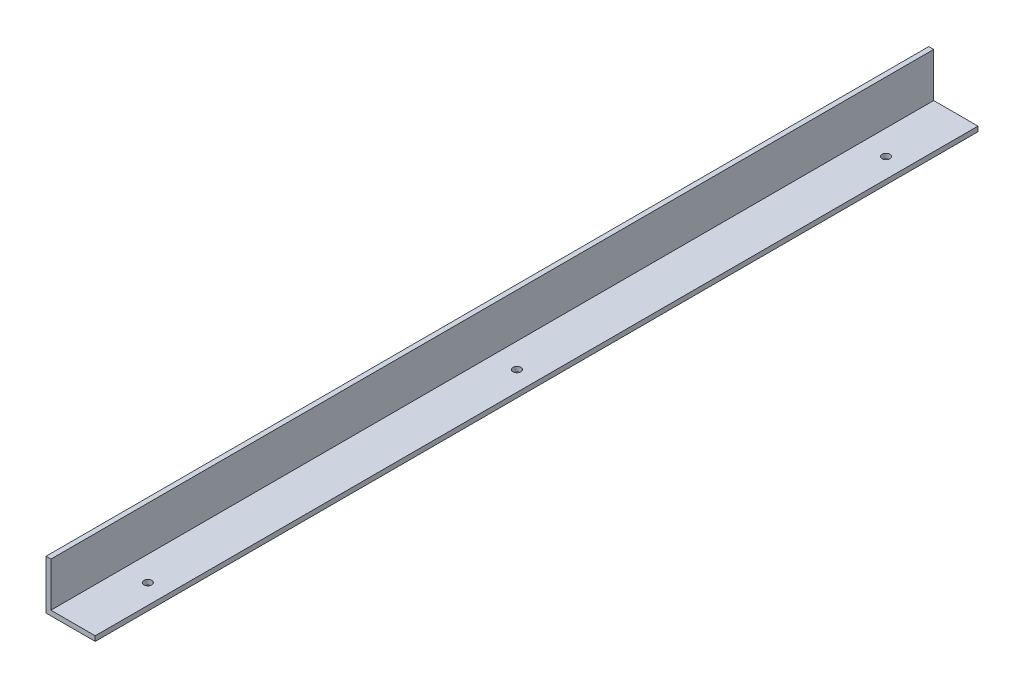
ISO-10303-21;
HEADER;
FILE_DESCRIPTION(('STEP AP214'),'2;1');
FILE_NAME('part.step','',(''),(''),'','','');
FILE_SCHEMA(('AUTOMOTIVE_DESIGN { 1 0 10303 214 1 1 1 1 }'));
ENDSEC;
DATA;
#1=APPLICATION_CONTEXT('core data for automotive mechanical design processes');
#2=APPLICATION_PROTOCOL_DEFINITION('international standard','automotive_design',2000,#1);
#3=PRODUCT_CONTEXT('',#1,'mechanical');
#4=PRODUCT('Part','Part','',(#3));
#5=PRODUCT_RELATED_PRODUCT_CATEGORY('part','',(#4));
#6=PRODUCT_DEFINITION_FORMATION('','',#4);
#7=PRODUCT_DEFINITION_CONTEXT('part definition',#1,'design');
#8=PRODUCT_DEFINITION('design','',#6,#7);
#9=PRODUCT_DEFINITION_SHAPE('','',#8);
#10=(LENGTH_UNIT() NAMED_UNIT(*) SI_UNIT(.MILLI.,.METRE.));
#11=(NAMED_UNIT(*) PLANE_ANGLE_UNIT() SI_UNIT($,.RADIAN.));
#12=(NAMED_UNIT(*) SI_UNIT($,.STERADIAN.) SOLID_ANGLE_UNIT());
#13=UNCERTAINTY_MEASURE_WITH_UNIT(LENGTH_MEASURE(1.E-05),#10,'distance_accuracy_value','');
#14=(GEOMETRIC_REPRESENTATION_CONTEXT(3) GLOBAL_UNCERTAINTY_ASSIGNED_CONTEXT((#13)) GLOBAL_UNIT_ASSIGNED_CONTEXT((#10,
#11,#12)) REPRESENTATION_CONTEXT('',''));
#15=CARTESIAN_POINT('',(0.,0.,0.));
#16=DIRECTION('',(0.,0.,1.));
#17=DIRECTION('',(1.,0.,0.));
#18=AXIS2_PLACEMENT_3D('',#15,#16,#17);
#19=CARTESIAN_POINT('',(6.07517582553863,-8.53025970804988,-375.));
#20=DIRECTION('',(0.,-0.999999999999998,0.));
#21=DIRECTION('',(1.,0.,0.));
#22=AXIS2_PLACEMENT_3D('',#19,#20,#21);
#23=CYLINDRICAL_SURFACE('',#22,4.);
#24=CARTESIAN_POINT('',(6.07517582553863,-18.5302597080499,-375.));
#25=DIRECTION('',(0.,-0.999999999999998,0.));
#26=DIRECTION('',(1.,0.,0.));
#27=AXIS2_PLACEMENT_3D('',#24,#25,#26);
#28=CIRCLE('',#27,4.);
#29=CARTESIAN_POINT('',(10.0751758255386,-18.5302597080499,-375.));
#30=VERTEX_POINT('',#29);
#31=EDGE_CURVE('E49',#30,#30,#28,.T.);
#32=CARTESIAN_POINT('',(6.07517582553863,-13.5302597080499,-375.));
#33=DIRECTION('',(0.,-0.999999999999998,0.));
#34=DIRECTION('',(1.,0.,0.));
#35=AXIS2_PLACEMENT_3D('',#32,#33,#34);
#36=CIRCLE('',#35,4.);
#37=CARTESIAN_POINT('',(10.0751758255386,-13.5302597080499,-375.));
#38=VERTEX_POINT('',#37);
#39=EDGE_CURVE('E11',#38,#38,#36,.T.);
#40=CARTESIAN_POINT('',(10.0751758255386,-18.5302597080499,-375.));
#41=CARTESIAN_POINT('',(10.0751758255386,-18.4781763747166,-375.));
#42=CARTESIAN_POINT('',(10.0751758255386,-18.4260930413832,-375.));
#43=CARTESIAN_POINT('',(10.0751758255386,-18.3219263747166,-375.));
#44=CARTESIAN_POINT('',(10.0751758255386,-18.2698430413832,-375.));
#45=CARTESIAN_POINT('',(10.0751758255386,-18.1656763747166,-375.));
#46=CARTESIAN_POINT('',(10.0751758255386,-18.1135930413832,-375.));
#47=CARTESIAN_POINT('',(10.0751758255386,-18.0094263747166,-375.));
#48=CARTESIAN_POINT('',(10.0751758255386,-17.9573430413832,-375.));
#49=CARTESIAN_POINT('',(10.0751758255386,-17.8531763747166,-375.));
#50=CARTESIAN_POINT('',(10.0751758255386,-17.8010930413832,-375.));
#51=CARTESIAN_POINT('',(10.0751758255386,-17.6969263747166,-375.));
#52=CARTESIAN_POINT('',(10.0751758255386,-17.6448430413832,-375.));
#53=CARTESIAN_POINT('',(10.0751758255386,-17.5406763747166,-375.));
#54=CARTESIAN_POINT('',(10.0751758255386,-17.4885930413832,-375.));
#55=CARTESIAN_POINT('',(10.0751758255386,-17.3844263747166,-375.));
#56=CARTESIAN_POINT('',(10.0751758255386,-17.3323430413832,-375.));
#57=CARTESIAN_POINT('',(10.0751758255386,-17.2281763747166,-375.));
#58=CARTESIAN_POINT('',(10.0751758255386,-17.1760930413832,-375.));
#59=CARTESIAN_POINT('',(10.0751758255386,-17.0719263747166,-375.));
#60=CARTESIAN_POINT('',(10.0751758255386,-17.0198430413832,-375.));
#61=CARTESIAN_POINT('',(10.0751758255386,-16.9156763747166,-375.));
#62=CARTESIAN_POINT('',(10.0751758255386,-16.8635930413832,-375.));
#63=CARTESIAN_POINT('',(10.0751758255386,-16.7594263747166,-375.));
#64=CARTESIAN_POINT('',(10.0751758255386,-16.7073430413832,-375.));
#65=CARTESIAN_POINT('',(10.0751758255386,-16.6031763747166,-375.));
#66=CARTESIAN_POINT('',(10.0751758255386,-16.5510930413832,-375.));
#67=CARTESIAN_POINT('',(10.0751758255386,-16.4469263747166,-375.));
#68=CARTESIAN_POINT('',(10.0751758255386,-16.3948430413832,-375.));
#69=CARTESIAN_POINT('',(10.0751758255386,-16.2906763747166,-375.));
#70=CARTESIAN_POINT('',(10.0751758255386,-16.2385930413832,-375.));
#71=CARTESIAN_POINT('',(10.0751758255386,-16.1344263747166,-375.));
#72=CARTESIAN_POINT('',(10.0751758255386,-16.0823430413832,-375.));
#73=CARTESIAN_POINT('',(10.0751758255386,-15.9781763747166,-375.));
#74=CARTESIAN_POINT('',(10.0751758255386,-15.9260930413832,-375.));
#75=CARTESIAN_POINT('',(10.0751758255386,-15.8219263747166,-375.));
#76=CARTESIAN_POINT('',(10.0751758255386,-15.7698430413832,-375.));
#77=CARTESIAN_POINT('',(10.0751758255386,-15.6656763747166,-375.));
#78=CARTESIAN_POINT('',(10.0751758255386,-15.6135930413832,-375.));
#79=CARTESIAN_POINT('',(10.0751758255386,-15.5094263747166,-375.));
#80=CARTESIAN_POINT('',(10.0751758255386,-15.4573430413832,-375.));
#81=CARTESIAN_POINT('',(10.0751758255386,-15.3531763747166,-375.));
#82=CARTESIAN_POINT('',(10.0751758255386,-15.3010930413832,-375.));
#83=CARTESIAN_POINT('',(10.0751758255386,-15.1969263747166,-375.));
#84=CARTESIAN_POINT('',(10.0751758255386,-15.1448430413832,-375.));
#85=CARTESIAN_POINT('',(10.0751758255386,-15.0406763747166,-375.));
#86=CARTESIAN_POINT('',(10.0751758255386,-14.9885930413832,-375.));
#87=CARTESIAN_POINT('',(10.0751758255386,-14.8844263747166,-375.));
#88=CARTESIAN_POINT('',(10.0751758255386,-14.8323430413832,-375.));
#89=CARTESIAN_POINT('',(10.0751758255386,-14.7281763747166,-375.));
#90=CARTESIAN_POINT('',(10.0751758255386,-14.6760930413832,-375.));
#91=CARTESIAN_POINT('',(10.0751758255386,-14.5719263747166,-375.));
#92=CARTESIAN_POINT('',(10.0751758255386,-14.5198430413832,-375.));
#93=CARTESIAN_POINT('',(10.0751758255386,-14.4156763747166,-375.));
#94=CARTESIAN_POINT('',(10.0751758255386,-14.3635930413832,-375.));
#95=CARTESIAN_POINT('',(10.0751758255386,-14.2594263747166,-375.));
#96=CARTESIAN_POINT('',(10.0751758255386,-14.2073430413832,-375.));
#97=CARTESIAN_POINT('',(10.0751758255386,-14.1031763747166,-375.));
#98=CARTESIAN_POINT('',(10.0751758255386,-14.0510930413832,-375.));
#99=CARTESIAN_POINT('',(10.0751758255386,-13.9469263747166,-375.));
#100=CARTESIAN_POINT('',(10.0751758255386,-13.8948430413832,-375.));
#101=CARTESIAN_POINT('',(10.0751758255386,-13.7906763747166,-375.));
#102=CARTESIAN_POINT('',(10.0751758255386,-13.7385930413832,-375.));
#103=CARTESIAN_POINT('',(10.0751758255386,-13.6344263747166,-375.));
#104=CARTESIAN_POINT('',(10.0751758255386,-13.5823430413832,-375.));
#105=CARTESIAN_POINT('',(10.0751758255386,-13.5302597080499,-375.));
#106=B_SPLINE_CURVE_WITH_KNOTS('',3,(#40,#41,#42,#43,#44,#45,#46,#47,#48,#49,#50,#51,#52,#53,
#54,#55,#56,#57,#58,#59,#60,#61,#62,#63,#64,#65,#66,#67,#68,#69,#70,#71,#72,#73,#74,#75,#76,#77,
#78,#79,#80,#81,#82,#83,#84,#85,#86,#87,#88,#89,#90,#91,#92,#93,#94,#95,#96,#97,#98,#99,#100,
#101,#102,#103,#104,#105),.UNSPECIFIED.,.F.,.F.,(4,2,2,2,2,2,2,2,2,2,2,2,2,2,2,2,2,2,2,2,2,2,2,
2,2,2,2,2,2,2,2,2,4),(0.,0.156249999999997,0.3125,0.468749999999997,0.625000000000001,
0.781249999999997,0.937500000000001,1.09375,1.25,1.40625,1.5625,1.71875,1.875,2.03125,2.1875,
2.34375,2.5,2.65625,2.8125,2.96875,3.125,3.28125,3.4375,3.59375,3.75,3.90625,4.0625,4.21875,
4.375,4.53125,4.6875,4.84375,5.),.UNSPECIFIED.);
#107=EDGE_CURVE('BSEAM40',#30,#38,#106,.T.);
#108=ORIENTED_EDGE('',*,*,#31,.T.);
#109=ORIENTED_EDGE('',*,*,#39,.F.);
#110=ORIENTED_EDGE('',*,*,#107,.T.);
#111=ORIENTED_EDGE('',*,*,#107,.F.);
#112=EDGE_LOOP('',(#108,#110,#109,#111));
#113=FACE_BOUND('',#112,.T.);
#114=ADVANCED_FACE('F40',(#113),#23,.F.);
#115=CARTESIAN_POINT('',(-23.9248241744614,31.4697402919498,448.5));
#116=DIRECTION('',(0.,-0.999999999999998,0.));
#117=DIRECTION('',(0.,0.,-1.));
#118=AXIS2_PLACEMENT_3D('',#115,#116,#117);
#119=PLANE('',#118);
#120=DIRECTION('',(-1.,0.,0.));
#121=VECTOR('',#120,1.);
#122=CARTESIAN_POINT('',(-23.9248241744615,31.4697402919498,-448.5));
#123=LINE('',#122,#121);
#124=CARTESIAN_POINT('',(-18.9248241744615,31.4697402919498,-448.5));
#125=VERTEX_POINT('',#124);
#126=CARTESIAN_POINT('',(-23.9248241744615,31.4697402919498,-448.5));
#127=VERTEX_POINT('',#126);
#128=EDGE_CURVE('E132',#125,#127,#123,.T.);
#129=ORIENTED_EDGE('',*,*,#128,.T.);
#130=DIRECTION('',(0.,0.,-1.));
#131=VECTOR('',#130,1.);
#132=CARTESIAN_POINT('',(-23.9248241744614,31.4697402919498,448.5));
#133=LINE('',#132,#131);
#134=CARTESIAN_POINT('',(-23.9248241744614,31.4697402919498,448.5));
#135=VERTEX_POINT('',#134);
#136=EDGE_CURVE('E160',#135,#127,#133,.T.);
#137=ORIENTED_EDGE('',*,*,#136,.F.);
#138=DIRECTION('',(-1.,0.,0.));
#139=VECTOR('',#138,1.);
#140=CARTESIAN_POINT('',(-23.9248241744614,31.4697402919498,448.5));
#141=LINE('',#140,#139);
#142=CARTESIAN_POINT('',(-18.9248241744615,31.4697402919498,448.5));
#143=VERTEX_POINT('',#142);
#144=EDGE_CURVE('E149',#143,#135,#141,.T.);
#145=ORIENTED_EDGE('',*,*,#144,.F.);
#146=DIRECTION('',(0.,0.,-1.));
#147=VECTOR('',#146,1.);
#148=CARTESIAN_POINT('',(-18.9248241744615,31.4697402919498,448.5));
#149=LINE('',#148,#147);
#150=EDGE_CURVE('E128',#143,#125,#149,.T.);
#151=ORIENTED_EDGE('',*,*,#150,.T.);
#152=EDGE_LOOP('',(#129,#137,#145,#151));
#153=FACE_BOUND('',#152,.T.);
#154=ADVANCED_FACE('F183',(#153),#119,.F.);
#155=CARTESIAN_POINT('',(-23.9248241744614,-18.5302597080502,448.5));
#156=DIRECTION('',(1.,0.,0.));
#157=DIRECTION('',(0.,0.,-1.));
#158=AXIS2_PLACEMENT_3D('',#155,#156,#157);
#159=PLANE('',#158);
#160=DIRECTION('',(0.,-0.999999999999998,0.));
#161=VECTOR('',#160,1.);
#162=CARTESIAN_POINT('',(-23.9248241744615,-18.5302597080501,-448.5));
#163=LINE('',#162,#161);
#164=CARTESIAN_POINT('',(-23.9248241744615,-18.5302597080501,-448.5));
#165=VERTEX_POINT('',#164);
#166=EDGE_CURVE('E136',#127,#165,#163,.T.);
#167=ORIENTED_EDGE('',*,*,#166,.T.);
#168=DIRECTION('',(0.,0.,-1.));
#169=VECTOR('',#168,1.);
#170=CARTESIAN_POINT('',(-23.9248241744614,-18.5302597080502,448.5));
#171=LINE('',#170,#169);
#172=CARTESIAN_POINT('',(-23.9248241744614,-18.5302597080502,448.5));
#173=VERTEX_POINT('',#172);
#174=EDGE_CURVE('E156',#173,#165,#171,.T.);
#175=ORIENTED_EDGE('',*,*,#174,.F.);
#176=DIRECTION('',(0.,-0.999999999999998,0.));
#177=VECTOR('',#176,1.);
#178=CARTESIAN_POINT('',(-23.9248241744614,-18.5302597080502,448.5));
#179=LINE('',#178,#177);
#180=EDGE_CURVE('E95',#135,#173,#179,.T.);
#181=ORIENTED_EDGE('',*,*,#180,.F.);
#182=ORIENTED_EDGE('',*,*,#136,.T.);
#183=EDGE_LOOP('',(#167,#175,#181,#182));
#184=FACE_BOUND('',#183,.T.);
#185=ADVANCED_FACE('F175',(#184),#159,.F.);
#186=CARTESIAN_POINT('',(26.0751758255386,-18.5302597080499,448.5));
#187=DIRECTION('',(0.,0.999999999999998,0.));
#188=DIRECTION('',(-1.,0.,0.));
#189=AXIS2_PLACEMENT_3D('',#186,#187,#188);
#190=PLANE('',#189);
#191=CARTESIAN_POINT('',(6.07517582553863,-18.5302597080499,0.));
#192=DIRECTION('',(0.,-0.999999999999998,0.));
#193=DIRECTION('',(1.,0.,0.));
#194=AXIS2_PLACEMENT_3D('',#191,#192,#193);
#195=CIRCLE('',#194,4.);
#196=CARTESIAN_POINT('',(10.0751758255386,-18.5302597080499,0.));
#197=VERTEX_POINT('',#196);
#198=EDGE_CURVE('E215',#197,#197,#195,.T.);
#199=ORIENTED_EDGE('',*,*,#198,.F.);
#200=EDGE_LOOP('',(#199));
#201=FACE_BOUND('',#200,.T.);
#202=CARTESIAN_POINT('',(6.07517582553857,-18.5302597080501,375.));
#203=DIRECTION('',(0.,-0.999999999999998,0.));
#204=DIRECTION('',(1.,0.,0.));
#205=AXIS2_PLACEMENT_3D('',#202,#203,#204);
#206=CIRCLE('',#205,4.);
#207=CARTESIAN_POINT('',(10.0751758255386,-18.5302597080501,375.));
#208=VERTEX_POINT('',#207);
#209=EDGE_CURVE('E165',#208,#208,#206,.T.);
#210=ORIENTED_EDGE('',*,*,#209,.F.);
#211=EDGE_LOOP('',(#210));
#212=FACE_BOUND('',#211,.T.);
#213=DIRECTION('',(1.,0.,0.));
#214=VECTOR('',#213,1.);
#215=CARTESIAN_POINT('',(26.0751758255386,-18.5302597080499,-448.5));
#216=LINE('',#215,#214);
#217=CARTESIAN_POINT('',(26.0751758255386,-18.5302597080499,-448.5));
#218=VERTEX_POINT('',#217);
#219=EDGE_CURVE('E140',#165,#218,#216,.T.);
#220=ORIENTED_EDGE('',*,*,#219,.T.);
#221=DIRECTION('',(0.,0.,-1.));
#222=VECTOR('',#221,1.);
#223=CARTESIAN_POINT('',(26.0751758255386,-18.5302597080499,448.5));
#224=LINE('',#223,#222);
#225=CARTESIAN_POINT('',(26.0751758255386,-18.5302597080499,448.5));
#226=VERTEX_POINT('',#225);
#227=EDGE_CURVE('E119',#226,#218,#224,.T.);
#228=ORIENTED_EDGE('',*,*,#227,.F.);
#229=DIRECTION('',(1.,0.,0.));
#230=VECTOR('',#229,1.);
#231=CARTESIAN_POINT('',(26.0751758255386,-18.5302597080499,448.5));
#232=LINE('',#231,#230);
#233=EDGE_CURVE('E108',#173,#226,#232,.T.);
#234=ORIENTED_EDGE('',*,*,#233,.F.);
#235=ORIENTED_EDGE('',*,*,#174,.T.);
#236=EDGE_LOOP('',(#220,#228,#234,#235));
#237=FACE_BOUND('',#236,.T.);
#238=ORIENTED_EDGE('',*,*,#31,.F.);
#239=EDGE_LOOP('',(#238));
#240=FACE_BOUND('',#239,.T.);
#241=ADVANCED_FACE('F173',(#201,#212,#237,#240),#190,.F.);
#242=CARTESIAN_POINT('',(26.0751758255386,-13.5302597080499,448.5));
#243=DIRECTION('',(-1.,0.,0.));
#244=DIRECTION('',(0.,0.,1.));
#245=AXIS2_PLACEMENT_3D('',#242,#243,#244);
#246=PLANE('',#245);
#247=DIRECTION('',(0.,0.999999999999998,0.));
#248=VECTOR('',#247,1.);
#249=CARTESIAN_POINT('',(26.0751758255386,-13.5302597080499,-448.5));
#250=LINE('',#249,#248);
#251=CARTESIAN_POINT('',(26.0751758255386,-13.5302597080499,-448.5));
#252=VERTEX_POINT('',#251);
#253=EDGE_CURVE('E117',#218,#252,#250,.T.);
#254=ORIENTED_EDGE('',*,*,#253,.T.);
#255=DIRECTION('',(0.,0.,-1.));
#256=VECTOR('',#255,1.);
#257=CARTESIAN_POINT('',(26.0751758255386,-13.5302597080499,448.5));
#258=LINE('',#257,#256);
#259=CARTESIAN_POINT('',(26.0751758255386,-13.5302597080499,448.5));
#260=VERTEX_POINT('',#259);
#261=EDGE_CURVE('E114',#260,#252,#258,.T.);
#262=ORIENTED_EDGE('',*,*,#261,.F.);
#263=DIRECTION('',(0.,0.999999999999998,0.));
#264=VECTOR('',#263,1.);
#265=CARTESIAN_POINT('',(26.0751758255386,-13.5302597080499,448.5));
#266=LINE('',#265,#264);
#267=EDGE_CURVE('E102',#226,#260,#266,.T.);
#268=ORIENTED_EDGE('',*,*,#267,.F.);
#269=ORIENTED_EDGE('',*,*,#227,.T.);
#270=EDGE_LOOP('',(#254,#262,#268,#269));
#271=FACE_BOUND('',#270,.T.);
#272=ADVANCED_FACE('F115',(#271),#246,.F.);
#273=CARTESIAN_POINT('',(-18.9248241744615,-13.5302597080502,448.5));
#274=DIRECTION('',(0.,-0.999999999999998,0.));
#275=DIRECTION('',(1.,0.,0.));
#276=AXIS2_PLACEMENT_3D('',#273,#274,#275);
#277=PLANE('',#276);
#278=CARTESIAN_POINT('',(6.07517582553863,-13.5302597080499,0.));
#279=DIRECTION('',(0.,-0.999999999999998,0.));
#280=DIRECTION('',(1.,0.,0.));
#281=AXIS2_PLACEMENT_3D('',#278,#279,#280);
#282=CIRCLE('',#281,4.);
#283=CARTESIAN_POINT('',(10.0751758255386,-13.5302597080499,0.));
#284=VERTEX_POINT('',#283);
#285=EDGE_CURVE('E211',#284,#284,#282,.T.);
#286=ORIENTED_EDGE('',*,*,#285,.T.);
#287=EDGE_LOOP('',(#286));
#288=FACE_BOUND('',#287,.T.);
#289=CARTESIAN_POINT('',(6.07517582553857,-13.5302597080501,375.));
#290=DIRECTION('',(0.,-0.999999999999998,0.));
#291=DIRECTION('',(1.,0.,0.));
#292=AXIS2_PLACEMENT_3D('',#289,#290,#291);
#293=CIRCLE('',#292,4.);
#294=CARTESIAN_POINT('',(10.0751758255386,-13.5302597080501,375.));
#295=VERTEX_POINT('',#294);
#296=EDGE_CURVE('E137',#295,#295,#293,.T.);
#297=ORIENTED_EDGE('',*,*,#296,.T.);
#298=EDGE_LOOP('',(#297));
#299=FACE_BOUND('',#298,.T.);
#300=DIRECTION('',(-1.,0.,0.));
#301=VECTOR('',#300,1.);
#302=CARTESIAN_POINT('',(-18.9248241744615,-13.53025970805,-448.5));
#303=LINE('',#302,#301);
#304=CARTESIAN_POINT('',(-18.9248241744615,-13.53025970805,-448.5));
#305=VERTEX_POINT('',#304);
#306=EDGE_CURVE('E80',#252,#305,#303,.T.);
#307=ORIENTED_EDGE('',*,*,#306,.T.);
#308=DIRECTION('',(0.,0.,-1.));
#309=VECTOR('',#308,1.);
#310=CARTESIAN_POINT('',(-18.9248241744615,-13.5302597080502,448.5));
#311=LINE('',#310,#309);
#312=CARTESIAN_POINT('',(-18.9248241744615,-13.5302597080502,448.5));
#313=VERTEX_POINT('',#312);
#314=EDGE_CURVE('E120',#313,#305,#311,.T.);
#315=ORIENTED_EDGE('',*,*,#314,.F.);
#316=DIRECTION('',(-1.,0.,0.));
#317=VECTOR('',#316,1.);
#318=CARTESIAN_POINT('',(-18.9248241744615,-13.5302597080502,448.5));
#319=LINE('',#318,#317);
#320=EDGE_CURVE('E106',#260,#313,#319,.T.);
#321=ORIENTED_EDGE('',*,*,#320,.F.);
#322=ORIENTED_EDGE('',*,*,#261,.T.);
#323=EDGE_LOOP('',(#307,#315,#321,#322));
#324=FACE_BOUND('',#323,.T.);
#325=ORIENTED_EDGE('',*,*,#39,.T.);
#326=EDGE_LOOP('',(#325));
#327=FACE_BOUND('',#326,.T.);
#328=ADVANCED_FACE('F122',(#288,#299,#324,#327),#277,.F.);
#329=CARTESIAN_POINT('',(-18.9248241744615,31.4697402919498,448.5));
#330=DIRECTION('',(-1.,0.,0.));
#331=DIRECTION('',(0.,-0.999999999999998,0.));
#332=AXIS2_PLACEMENT_3D('',#329,#330,#331);
#333=PLANE('',#332);
#334=DIRECTION('',(0.,0.999999999999998,0.));
#335=VECTOR('',#334,1.);
#336=CARTESIAN_POINT('',(-18.9248241744615,31.4697402919498,-448.5));
#337=LINE('',#336,#335);
#338=EDGE_CURVE('E86',#305,#125,#337,.T.);
#339=ORIENTED_EDGE('',*,*,#338,.T.);
#340=ORIENTED_EDGE('',*,*,#150,.F.);
#341=DIRECTION('',(0.,0.999999999999998,0.));
#342=VECTOR('',#341,1.);
#343=CARTESIAN_POINT('',(-18.9248241744615,31.4697402919498,448.5));
#344=LINE('',#343,#342);
#345=EDGE_CURVE('E57',#313,#143,#344,.T.);
#346=ORIENTED_EDGE('',*,*,#345,.F.);
#347=ORIENTED_EDGE('',*,*,#314,.T.);
#348=EDGE_LOOP('',(#339,#340,#346,#347));
#349=FACE_BOUND('',#348,.T.);
#350=ADVANCED_FACE('F229',(#349),#333,.F.);
#351=CARTESIAN_POINT('',(0.,-3.33066907387547E-13,448.5));
#352=DIRECTION('',(0.,0.,-1.));
#353=DIRECTION('',(-1.,0.,0.));
#354=AXIS2_PLACEMENT_3D('',#351,#352,#353);
#355=PLANE('',#354);
#356=ORIENTED_EDGE('',*,*,#144,.T.);
#357=ORIENTED_EDGE('',*,*,#180,.T.);
#358=ORIENTED_EDGE('',*,*,#233,.T.);
#359=ORIENTED_EDGE('',*,*,#267,.T.);
#360=ORIENTED_EDGE('',*,*,#320,.T.);
#361=ORIENTED_EDGE('',*,*,#345,.T.);
#362=EDGE_LOOP('',(#356,#357,#358,#359,#360,#361));
#363=FACE_BOUND('',#362,.T.);
#364=ADVANCED_FACE('F104',(#363),#355,.F.);
#365=CARTESIAN_POINT('',(0.,0.,-448.5));
#366=DIRECTION('',(0.,0.,-1.));
#367=DIRECTION('',(-1.,0.,0.));
#368=AXIS2_PLACEMENT_3D('',#365,#366,#367);
#369=PLANE('',#368);
#370=ORIENTED_EDGE('',*,*,#128,.F.);
#371=ORIENTED_EDGE('',*,*,#338,.F.);
#372=ORIENTED_EDGE('',*,*,#306,.F.);
#373=ORIENTED_EDGE('',*,*,#253,.F.);
#374=ORIENTED_EDGE('',*,*,#219,.F.);
#375=ORIENTED_EDGE('',*,*,#166,.F.);
#376=EDGE_LOOP('',(#370,#371,#372,#373,#374,#375));
#377=FACE_BOUND('',#376,.T.);
#378=ADVANCED_FACE('F198',(#377),#369,.T.);
#379=CARTESIAN_POINT('',(6.07517582553863,-8.5302597080501,375.));
#380=DIRECTION('',(0.,-0.999999999999998,0.));
#381=DIRECTION('',(1.,0.,0.));
#382=AXIS2_PLACEMENT_3D('',#379,#380,#381);
#383=CYLINDRICAL_SURFACE('',#382,4.);
#384=CARTESIAN_POINT('',(10.0751758255386,-18.5302597080501,375.));
#385=CARTESIAN_POINT('',(10.0751758255386,-18.4781763747168,375.));
#386=CARTESIAN_POINT('',(10.0751758255386,-18.4260930413834,375.));
#387=CARTESIAN_POINT('',(10.0751758255386,-18.3219263747168,375.));
#388=CARTESIAN_POINT('',(10.0751758255386,-18.2698430413834,375.));
#389=CARTESIAN_POINT('',(10.0751758255386,-18.1656763747168,375.));
#390=CARTESIAN_POINT('',(10.0751758255386,-18.1135930413834,375.));
#391=CARTESIAN_POINT('',(10.0751758255386,-18.0094263747168,375.));
#392=CARTESIAN_POINT('',(10.0751758255386,-17.9573430413834,375.));
#393=CARTESIAN_POINT('',(10.0751758255386,-17.8531763747168,375.));
#394=CARTESIAN_POINT('',(10.0751758255386,-17.8010930413834,375.));
#395=CARTESIAN_POINT('',(10.0751758255386,-17.6969263747168,375.));
#396=CARTESIAN_POINT('',(10.0751758255386,-17.6448430413834,375.));
#397=CARTESIAN_POINT('',(10.0751758255386,-17.5406763747168,375.));
#398=CARTESIAN_POINT('',(10.0751758255386,-17.4885930413834,375.));
#399=CARTESIAN_POINT('',(10.0751758255386,-17.3844263747168,375.));
#400=CARTESIAN_POINT('',(10.0751758255386,-17.3323430413834,375.));
#401=CARTESIAN_POINT('',(10.0751758255386,-17.2281763747168,375.));
#402=CARTESIAN_POINT('',(10.0751758255386,-17.1760930413834,375.));
#403=CARTESIAN_POINT('',(10.0751758255386,-17.0719263747168,375.));
#404=CARTESIAN_POINT('',(10.0751758255386,-17.0198430413834,375.));
#405=CARTESIAN_POINT('',(10.0751758255386,-16.9156763747168,375.));
#406=CARTESIAN_POINT('',(10.0751758255386,-16.8635930413834,375.));
#407=CARTESIAN_POINT('',(10.0751758255386,-16.7594263747168,375.));
#408=CARTESIAN_POINT('',(10.0751758255386,-16.7073430413834,375.));
#409=CARTESIAN_POINT('',(10.0751758255386,-16.6031763747168,375.));
#410=CARTESIAN_POINT('',(10.0751758255386,-16.5510930413834,375.));
#411=CARTESIAN_POINT('',(10.0751758255386,-16.4469263747168,375.));
#412=CARTESIAN_POINT('',(10.0751758255386,-16.3948430413834,375.));
#413=CARTESIAN_POINT('',(10.0751758255386,-16.2906763747168,375.));
#414=CARTESIAN_POINT('',(10.0751758255386,-16.2385930413834,375.));
#415=CARTESIAN_POINT('',(10.0751758255386,-16.1344263747168,375.));
#416=CARTESIAN_POINT('',(10.0751758255386,-16.0823430413834,375.));
#417=CARTESIAN_POINT('',(10.0751758255386,-15.9781763747168,375.));
#418=CARTESIAN_POINT('',(10.0751758255386,-15.9260930413834,375.));
#419=CARTESIAN_POINT('',(10.0751758255386,-15.8219263747168,375.));
#420=CARTESIAN_POINT('',(10.0751758255386,-15.7698430413834,375.));
#421=CARTESIAN_POINT('',(10.0751758255386,-15.6656763747168,375.));
#422=CARTESIAN_POINT('',(10.0751758255386,-15.6135930413834,375.));
#423=CARTESIAN_POINT('',(10.0751758255386,-15.5094263747168,375.));
#424=CARTESIAN_POINT('',(10.0751758255386,-15.4573430413834,375.));
#425=CARTESIAN_POINT('',(10.0751758255386,-15.3531763747168,375.));
#426=CARTESIAN_POINT('',(10.0751758255386,-15.3010930413834,375.));
#427=CARTESIAN_POINT('',(10.0751758255386,-15.1969263747168,375.));
#428=CARTESIAN_POINT('',(10.0751758255386,-15.1448430413834,375.));
#429=CARTESIAN_POINT('',(10.0751758255386,-15.0406763747168,375.));
#430=CARTESIAN_POINT('',(10.0751758255386,-14.9885930413834,375.));
#431=CARTESIAN_POINT('',(10.0751758255386,-14.8844263747168,375.));
#432=CARTESIAN_POINT('',(10.0751758255386,-14.8323430413834,375.));
#433=CARTESIAN_POINT('',(10.0751758255386,-14.7281763747168,375.));
#434=CARTESIAN_POINT('',(10.0751758255386,-14.6760930413834,375.));
#435=CARTESIAN_POINT('',(10.0751758255386,-14.5719263747168,375.));
#436=CARTESIAN_POINT('',(10.0751758255386,-14.5198430413834,375.));
#437=CARTESIAN_POINT('',(10.0751758255386,-14.4156763747168,375.));
#438=CARTESIAN_POINT('',(10.0751758255386,-14.3635930413834,375.));
#439=CARTESIAN_POINT('',(10.0751758255386,-14.2594263747168,375.));
#440=CARTESIAN_POINT('',(10.0751758255386,-14.2073430413834,375.));
#441=CARTESIAN_POINT('',(10.0751758255386,-14.1031763747168,375.));
#442=CARTESIAN_POINT('',(10.0751758255386,-14.0510930413834,375.));
#443=CARTESIAN_POINT('',(10.0751758255386,-13.9469263747168,375.));
#444=CARTESIAN_POINT('',(10.0751758255386,-13.8948430413834,375.));
#445=CARTESIAN_POINT('',(10.0751758255386,-13.7906763747168,375.));
#446=CARTESIAN_POINT('',(10.0751758255386,-13.7385930413834,375.));
#447=CARTESIAN_POINT('',(10.0751758255386,-13.6344263747168,375.));
#448=CARTESIAN_POINT('',(10.0751758255386,-13.5823430413834,375.));
#449=CARTESIAN_POINT('',(10.0751758255386,-13.5302597080501,375.));
#450=B_SPLINE_CURVE_WITH_KNOTS('',3,(#384,#385,#386,#387,#388,#389,#390,#391,#392,#393,#394,
#395,#396,#397,#398,#399,#400,#401,#402,#403,#404,#405,#406,#407,#408,#409,#410,#411,#412,#413,
#414,#415,#416,#417,#418,#419,#420,#421,#422,#423,#424,#425,#426,#427,#428,#429,#430,#431,#432,
#433,#434,#435,#436,#437,#438,#439,#440,#441,#442,#443,#444,#445,#446,#447,#448,#449),
.UNSPECIFIED.,.F.,.F.,(4,2,2,2,2,2,2,2,2,2,2,2,2,2,2,2,2,2,2,2,2,2,2,2,2,2,2,2,2,2,2,2,4),(0.,
0.156249999999997,0.3125,0.468749999999997,0.625000000000001,0.781249999999997,
0.937500000000001,1.09375,1.25,1.40625,1.5625,1.71875,1.875,2.03125,2.1875,2.34375,2.5,2.65625,
2.8125,2.96875,3.125,3.28125,3.4375,3.59375,3.75,3.90625,4.0625,4.21875,4.375,4.53125,4.6875,
4.84375,5.),.UNSPECIFIED.);
#451=EDGE_CURVE('BSEAM223',#208,#295,#450,.T.);
#452=ORIENTED_EDGE('',*,*,#209,.T.);
#453=ORIENTED_EDGE('',*,*,#296,.F.);
#454=ORIENTED_EDGE('',*,*,#451,.T.);
#455=ORIENTED_EDGE('',*,*,#451,.F.);
#456=EDGE_LOOP('',(#452,#454,#453,#455));
#457=FACE_BOUND('',#456,.T.);
#458=ADVANCED_FACE('F223',(#457),#383,.F.);
#459=CARTESIAN_POINT('',(6.07517582553863,-8.53025970804988,0.));
#460=DIRECTION('',(0.,-0.999999999999998,0.));
#461=DIRECTION('',(1.,0.,0.));
#462=AXIS2_PLACEMENT_3D('',#459,#460,#461);
#463=CYLINDRICAL_SURFACE('',#462,4.);
#464=CARTESIAN_POINT('',(10.0751758255386,-18.5302597080499,0.));
#465=CARTESIAN_POINT('',(10.0751758255386,-18.4781763747166,0.));
#466=CARTESIAN_POINT('',(10.0751758255386,-18.4260930413832,0.));
#467=CARTESIAN_POINT('',(10.0751758255386,-18.3219263747166,0.));
#468=CARTESIAN_POINT('',(10.0751758255386,-18.2698430413832,0.));
#469=CARTESIAN_POINT('',(10.0751758255386,-18.1656763747166,0.));
#470=CARTESIAN_POINT('',(10.0751758255386,-18.1135930413832,0.));
#471=CARTESIAN_POINT('',(10.0751758255386,-18.0094263747166,0.));
#472=CARTESIAN_POINT('',(10.0751758255386,-17.9573430413832,0.));
#473=CARTESIAN_POINT('',(10.0751758255386,-17.8531763747166,0.));
#474=CARTESIAN_POINT('',(10.0751758255386,-17.8010930413832,0.));
#475=CARTESIAN_POINT('',(10.0751758255386,-17.6969263747166,0.));
#476=CARTESIAN_POINT('',(10.0751758255386,-17.6448430413832,0.));
#477=CARTESIAN_POINT('',(10.0751758255386,-17.5406763747166,0.));
#478=CARTESIAN_POINT('',(10.0751758255386,-17.4885930413832,0.));
#479=CARTESIAN_POINT('',(10.0751758255386,-17.3844263747166,0.));
#480=CARTESIAN_POINT('',(10.0751758255386,-17.3323430413832,0.));
#481=CARTESIAN_POINT('',(10.0751758255386,-17.2281763747166,0.));
#482=CARTESIAN_POINT('',(10.0751758255386,-17.1760930413832,0.));
#483=CARTESIAN_POINT('',(10.0751758255386,-17.0719263747166,0.));
#484=CARTESIAN_POINT('',(10.0751758255386,-17.0198430413832,0.));
#485=CARTESIAN_POINT('',(10.0751758255386,-16.9156763747166,0.));
#486=CARTESIAN_POINT('',(10.0751758255386,-16.8635930413832,0.));
#487=CARTESIAN_POINT('',(10.0751758255386,-16.7594263747166,0.));
#488=CARTESIAN_POINT('',(10.0751758255386,-16.7073430413832,0.));
#489=CARTESIAN_POINT('',(10.0751758255386,-16.6031763747166,0.));
#490=CARTESIAN_POINT('',(10.0751758255386,-16.5510930413832,0.));
#491=CARTESIAN_POINT('',(10.0751758255386,-16.4469263747166,0.));
#492=CARTESIAN_POINT('',(10.0751758255386,-16.3948430413832,0.));
#493=CARTESIAN_POINT('',(10.0751758255386,-16.2906763747166,0.));
#494=CARTESIAN_POINT('',(10.0751758255386,-16.2385930413832,0.));
#495=CARTESIAN_POINT('',(10.0751758255386,-16.1344263747166,0.));
#496=CARTESIAN_POINT('',(10.0751758255386,-16.0823430413832,0.));
#497=CARTESIAN_POINT('',(10.0751758255386,-15.9781763747166,0.));
#498=CARTESIAN_POINT('',(10.0751758255386,-15.9260930413832,0.));
#499=CARTESIAN_POINT('',(10.0751758255386,-15.8219263747166,0.));
#500=CARTESIAN_POINT('',(10.0751758255386,-15.7698430413832,0.));
#501=CARTESIAN_POINT('',(10.0751758255386,-15.6656763747166,0.));
#502=CARTESIAN_POINT('',(10.0751758255386,-15.6135930413832,0.));
#503=CARTESIAN_POINT('',(10.0751758255386,-15.5094263747166,0.));
#504=CARTESIAN_POINT('',(10.0751758255386,-15.4573430413832,0.));
#505=CARTESIAN_POINT('',(10.0751758255386,-15.3531763747166,0.));
#506=CARTESIAN_POINT('',(10.0751758255386,-15.3010930413832,0.));
#507=CARTESIAN_POINT('',(10.0751758255386,-15.1969263747166,0.));
#508=CARTESIAN_POINT('',(10.0751758255386,-15.1448430413832,0.));
#509=CARTESIAN_POINT('',(10.0751758255386,-15.0406763747166,0.));
#510=CARTESIAN_POINT('',(10.0751758255386,-14.9885930413832,0.));
#511=CARTESIAN_POINT('',(10.0751758255386,-14.8844263747166,0.));
#512=CARTESIAN_POINT('',(10.0751758255386,-14.8323430413832,0.));
#513=CARTESIAN_POINT('',(10.0751758255386,-14.7281763747166,0.));
#514=CARTESIAN_POINT('',(10.0751758255386,-14.6760930413832,0.));
#515=CARTESIAN_POINT('',(10.0751758255386,-14.5719263747166,0.));
#516=CARTESIAN_POINT('',(10.0751758255386,-14.5198430413832,0.));
#517=CARTESIAN_POINT('',(10.0751758255386,-14.4156763747166,0.));
#518=CARTESIAN_POINT('',(10.0751758255386,-14.3635930413832,0.));
#519=CARTESIAN_POINT('',(10.0751758255386,-14.2594263747166,0.));
#520=CARTESIAN_POINT('',(10.0751758255386,-14.2073430413832,0.));
#521=CARTESIAN_POINT('',(10.0751758255386,-14.1031763747166,0.));
#522=CARTESIAN_POINT('',(10.0751758255386,-14.0510930413832,0.));
#523=CARTESIAN_POINT('',(10.0751758255386,-13.9469263747166,0.));
#524=CARTESIAN_POINT('',(10.0751758255386,-13.8948430413832,0.));
#525=CARTESIAN_POINT('',(10.0751758255386,-13.7906763747166,0.));
#526=CARTESIAN_POINT('',(10.0751758255386,-13.7385930413832,0.));
#527=CARTESIAN_POINT('',(10.0751758255386,-13.6344263747166,0.));
#528=CARTESIAN_POINT('',(10.0751758255386,-13.5823430413832,0.));
#529=CARTESIAN_POINT('',(10.0751758255386,-13.5302597080499,0.));
#530=B_SPLINE_CURVE_WITH_KNOTS('',3,(#464,#465,#466,#467,#468,#469,#470,#471,#472,#473,#474,
#475,#476,#477,#478,#479,#480,#481,#482,#483,#484,#485,#486,#487,#488,#489,#490,#491,#492,#493,
#494,#495,#496,#497,#498,#499,#500,#501,#502,#503,#504,#505,#506,#507,#508,#509,#510,#511,#512,
#513,#514,#515,#516,#517,#518,#519,#520,#521,#522,#523,#524,#525,#526,#527,#528,#529),
.UNSPECIFIED.,.F.,.F.,(4,2,2,2,2,2,2,2,2,2,2,2,2,2,2,2,2,2,2,2,2,2,2,2,2,2,2,2,2,2,2,2,4),(0.,
0.156249999999997,0.3125,0.468749999999997,0.625000000000001,0.781249999999997,
0.937500000000001,1.09375,1.25,1.40625,1.5625,1.71875,1.875,2.03125,2.1875,2.34375,2.5,2.65625,
2.8125,2.96875,3.125,3.28125,3.4375,3.59375,3.75,3.90625,4.0625,4.21875,4.375,4.53125,4.6875,
4.84375,5.),.UNSPECIFIED.);
#531=EDGE_CURVE('BSEAM220',#197,#284,#530,.T.);
#532=ORIENTED_EDGE('',*,*,#198,.T.);
#533=ORIENTED_EDGE('',*,*,#285,.F.);
#534=ORIENTED_EDGE('',*,*,#531,.T.);
#535=ORIENTED_EDGE('',*,*,#531,.F.);
#536=EDGE_LOOP('',(#532,#534,#533,#535));
#537=FACE_BOUND('',#536,.T.);
#538=ADVANCED_FACE('F220',(#537),#463,.F.);
#539=CLOSED_SHELL('',(#114,#154,#185,#241,#272,#328,#350,#364,#378,#458,#538));
#540=MANIFOLD_SOLID_BREP('B2',#539);
#541=ADVANCED_BREP_SHAPE_REPRESENTATION('',(#18,#540),#14);
#542=SHAPE_DEFINITION_REPRESENTATION(#9,#541);
ENDSEC;
END-ISO-10303-21;
